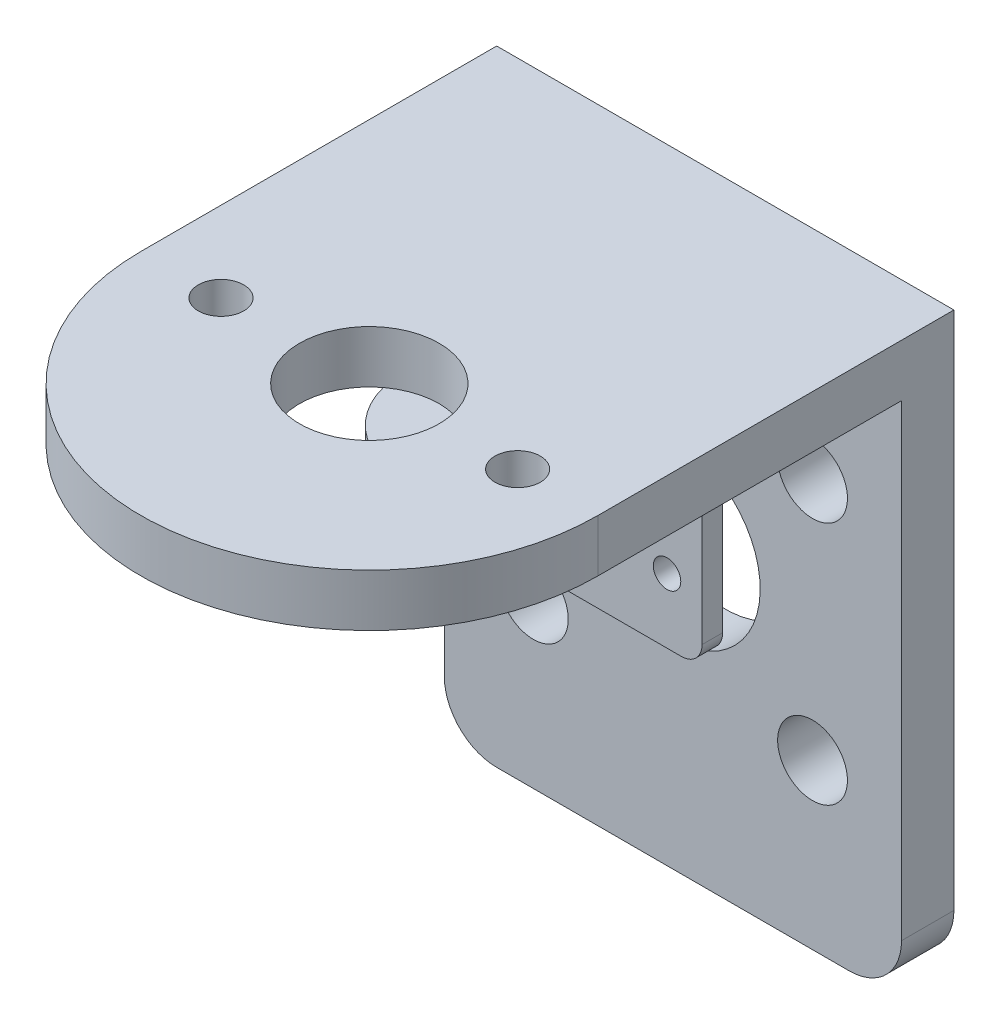
ISO-10303-21;
HEADER;
FILE_DESCRIPTION(('STEP AP214'),'2;1');
FILE_NAME('part.step','',(''),(''),'','','');
FILE_SCHEMA(('AUTOMOTIVE_DESIGN { 1 0 10303 214 1 1 1 1 }'));
ENDSEC;
DATA;
#1=APPLICATION_CONTEXT('core data for automotive mechanical design processes');
#2=APPLICATION_PROTOCOL_DEFINITION('international standard','automotive_design',2000,#1);
#3=PRODUCT_CONTEXT('',#1,'mechanical');
#4=PRODUCT('Part','Part','',(#3));
#5=PRODUCT_RELATED_PRODUCT_CATEGORY('part','',(#4));
#6=PRODUCT_DEFINITION_FORMATION('','',#4);
#7=PRODUCT_DEFINITION_CONTEXT('part definition',#1,'design');
#8=PRODUCT_DEFINITION('design','',#6,#7);
#9=PRODUCT_DEFINITION_SHAPE('','',#8);
#10=(LENGTH_UNIT() NAMED_UNIT(*) SI_UNIT(.MILLI.,.METRE.));
#11=(NAMED_UNIT(*) PLANE_ANGLE_UNIT() SI_UNIT($,.RADIAN.));
#12=(NAMED_UNIT(*) SI_UNIT($,.STERADIAN.) SOLID_ANGLE_UNIT());
#13=UNCERTAINTY_MEASURE_WITH_UNIT(LENGTH_MEASURE(1.E-05),#10,'distance_accuracy_value','');
#14=(GEOMETRIC_REPRESENTATION_CONTEXT(3) GLOBAL_UNCERTAINTY_ASSIGNED_CONTEXT((#13)) GLOBAL_UNIT_ASSIGNED_CONTEXT((#10,
#11,#12)) REPRESENTATION_CONTEXT('',''));
#15=CARTESIAN_POINT('',(0.,0.,0.));
#16=DIRECTION('',(0.,0.,1.));
#17=DIRECTION('',(1.,0.,0.));
#18=AXIS2_PLACEMENT_3D('',#15,#16,#17);
#19=CARTESIAN_POINT('',(33.274,172.119302794115,12.6989962074674));
#20=DIRECTION('',(0.,-1.,0.));
#21=DIRECTION('',(-1.,0.,0.));
#22=AXIS2_PLACEMENT_3D('',#19,#20,#21);
#23=PLANE('',#22);
#24=CARTESIAN_POINT('',(33.274,172.119302794115,12.6989962074674));
#25=DIRECTION('',(0.,-1.,0.));
#26=DIRECTION('',(1.,0.,0.));
#27=AXIS2_PLACEMENT_3D('',#24,#25,#26);
#28=CIRCLE('',#27,13.1);
#29=CARTESIAN_POINT('',(46.374,172.119302794115,12.6989962074674));
#30=VERTEX_POINT('',#29);
#31=CARTESIAN_POINT('',(20.174,172.119302794115,12.6989962074674));
#32=VERTEX_POINT('',#31);
#33=EDGE_CURVE('P0_E11',#30,#32,#28,.T.);
#34=ORIENTED_EDGE('',*,*,#33,.T.);
#35=DIRECTION('',(0.,0.,-1.));
#36=VECTOR('',#35,1.);
#37=CARTESIAN_POINT('',(20.174,172.119302794115,3.99899620746737));
#38=LINE('',#37,#36);
#39=CARTESIAN_POINT('',(20.174,172.119302794115,-4.70100379253262));
#40=VERTEX_POINT('',#39);
#41=EDGE_CURVE('P0_E220',#32,#40,#38,.T.);
#42=ORIENTED_EDGE('',*,*,#41,.T.);
#43=DIRECTION('',(1.,0.,0.));
#44=VECTOR('',#43,1.);
#45=CARTESIAN_POINT('',(33.274,172.119302794115,-4.70100379253262));
#46=LINE('',#45,#44);
#47=CARTESIAN_POINT('',(46.374,172.119302794115,-4.70100379253262));
#48=VERTEX_POINT('',#47);
#49=EDGE_CURVE('P0_E232',#40,#48,#46,.T.);
#50=ORIENTED_EDGE('',*,*,#49,.T.);
#51=DIRECTION('',(0.,0.,-1.));
#52=VECTOR('',#51,1.);
#53=CARTESIAN_POINT('',(46.374,172.119302794115,3.99899620746737));
#54=LINE('',#53,#52);
#55=EDGE_CURVE('P0_E225',#30,#48,#54,.T.);
#56=ORIENTED_EDGE('',*,*,#55,.F.);
#57=EDGE_LOOP('',(#34,#42,#50,#56));
#58=FACE_BOUND('',#57,.T.);
#59=CARTESIAN_POINT('',(24.774,172.119302794115,12.6989962074674));
#60=DIRECTION('',(0.,1.,0.));
#61=DIRECTION('',(0.,0.,1.));
#62=AXIS2_PLACEMENT_3D('',#59,#60,#61);
#63=CIRCLE('',#62,1.3);
#64=CARTESIAN_POINT('',(24.774,172.119302794115,13.9989962074674));
#65=VERTEX_POINT('',#64);
#66=EDGE_CURVE('P0_E218',#65,#65,#63,.T.);
#67=ORIENTED_EDGE('',*,*,#66,.T.);
#68=EDGE_LOOP('',(#67));
#69=FACE_BOUND('',#68,.T.);
#70=CARTESIAN_POINT('',(33.274,172.119302794115,12.6989962074674));
#71=DIRECTION('',(0.,1.,0.));
#72=DIRECTION('',(0.,0.,-1.));
#73=AXIS2_PLACEMENT_3D('',#70,#71,#72);
#74=CIRCLE('',#73,4.);
#75=CARTESIAN_POINT('',(33.274,172.119302794115,8.69899620746737));
#76=VERTEX_POINT('',#75);
#77=EDGE_CURVE('P0_E195',#76,#76,#74,.T.);
#78=ORIENTED_EDGE('',*,*,#77,.T.);
#79=EDGE_LOOP('',(#78));
#80=FACE_BOUND('',#79,.T.);
#81=CARTESIAN_POINT('',(41.774,172.119302794115,12.6989962074674));
#82=DIRECTION('',(0.,1.,0.));
#83=DIRECTION('',(0.,0.,-1.));
#84=AXIS2_PLACEMENT_3D('',#81,#82,#83);
#85=CIRCLE('',#84,1.3);
#86=CARTESIAN_POINT('',(41.774,172.119302794115,11.3989962074674));
#87=VERTEX_POINT('',#86);
#88=EDGE_CURVE('P0_E213',#87,#87,#85,.T.);
#89=ORIENTED_EDGE('',*,*,#88,.T.);
#90=EDGE_LOOP('',(#89));
#91=FACE_BOUND('',#90,.T.);
#92=ADVANCED_FACE('P0_F45',(#58,#69,#80,#91),#23,.T.);
#93=CARTESIAN_POINT('',(33.274,173.619302794115,12.6989962074674));
#94=DIRECTION('',(0.,-1.,0.));
#95=DIRECTION('',(1.,0.,0.));
#96=AXIS2_PLACEMENT_3D('',#93,#94,#95);
#97=CYLINDRICAL_SURFACE('',#96,13.1);
#98=DIRECTION('',(0.,1.,0.));
#99=VECTOR('',#98,1.);
#100=CARTESIAN_POINT('',(46.374,173.619302794115,12.6989962074674));
#101=LINE('',#100,#99);
#102=CARTESIAN_POINT('',(46.374,175.119302794115,12.6989962074674));
#103=VERTEX_POINT('',#102);
#104=EDGE_CURVE('P0_E227',#30,#103,#101,.T.);
#105=ORIENTED_EDGE('',*,*,#104,.T.);
#106=CARTESIAN_POINT('',(33.274,175.119302794115,12.6989962074674));
#107=DIRECTION('',(0.,1.,0.));
#108=DIRECTION('',(1.,0.,0.));
#109=AXIS2_PLACEMENT_3D('',#106,#107,#108);
#110=CIRCLE('',#109,13.1);
#111=CARTESIAN_POINT('',(20.174,175.119302794115,12.6989962074674));
#112=VERTEX_POINT('',#111);
#113=EDGE_CURVE('P0_E54',#112,#103,#110,.T.);
#114=ORIENTED_EDGE('',*,*,#113,.F.);
#115=DIRECTION('',(0.,-1.,0.));
#116=VECTOR('',#115,1.);
#117=CARTESIAN_POINT('',(20.174,173.619302794115,12.6989962074674));
#118=LINE('',#117,#116);
#119=EDGE_CURVE('P0_E224',#112,#32,#118,.T.);
#120=ORIENTED_EDGE('',*,*,#119,.T.);
#121=ORIENTED_EDGE('',*,*,#33,.F.);
#122=EDGE_LOOP('',(#105,#114,#120,#121));
#123=FACE_BOUND('',#122,.T.);
#124=ADVANCED_FACE('P0_F270',(#123),#97,.T.);
#125=CARTESIAN_POINT('',(33.274,175.119302794115,12.6989962074674));
#126=DIRECTION('',(0.,1.,0.));
#127=DIRECTION('',(1.,0.,0.));
#128=AXIS2_PLACEMENT_3D('',#125,#126,#127);
#129=PLANE('',#128);
#130=ORIENTED_EDGE('',*,*,#113,.T.);
#131=DIRECTION('',(0.,0.,-1.));
#132=VECTOR('',#131,1.);
#133=CARTESIAN_POINT('',(46.374,175.119302794115,3.99899620746737));
#134=LINE('',#133,#132);
#135=CARTESIAN_POINT('',(46.374,175.119302794115,-7.70100379253263));
#136=VERTEX_POINT('',#135);
#137=EDGE_CURVE('P0_E223',#103,#136,#134,.T.);
#138=ORIENTED_EDGE('',*,*,#137,.T.);
#139=DIRECTION('',(1.,0.,0.));
#140=VECTOR('',#139,1.);
#141=CARTESIAN_POINT('',(33.274,175.119302794115,-7.70100379253263));
#142=LINE('',#141,#140);
#143=CARTESIAN_POINT('',(20.174,175.119302794115,-7.70100379253263));
#144=VERTEX_POINT('',#143);
#145=EDGE_CURVE('P0_E199',#144,#136,#142,.T.);
#146=ORIENTED_EDGE('',*,*,#145,.F.);
#147=DIRECTION('',(0.,0.,-1.));
#148=VECTOR('',#147,1.);
#149=CARTESIAN_POINT('',(20.174,175.119302794115,-6.20100379253263));
#150=LINE('',#149,#148);
#151=EDGE_CURVE('P0_E221',#112,#144,#150,.T.);
#152=ORIENTED_EDGE('',*,*,#151,.F.);
#153=EDGE_LOOP('',(#130,#138,#146,#152));
#154=FACE_BOUND('',#153,.T.);
#155=CARTESIAN_POINT('',(24.774,175.119302794115,12.6989962074674));
#156=DIRECTION('',(0.,-1.,0.));
#157=DIRECTION('',(0.,0.,1.));
#158=AXIS2_PLACEMENT_3D('',#155,#156,#157);
#159=CIRCLE('',#158,1.3);
#160=CARTESIAN_POINT('',(24.774,175.119302794115,13.9989962074674));
#161=VERTEX_POINT('',#160);
#162=EDGE_CURVE('P0_E196',#161,#161,#159,.T.);
#163=ORIENTED_EDGE('',*,*,#162,.T.);
#164=EDGE_LOOP('',(#163));
#165=FACE_BOUND('',#164,.T.);
#166=CARTESIAN_POINT('',(33.274,175.119302794115,12.6989962074674));
#167=DIRECTION('',(0.,-1.,0.));
#168=DIRECTION('',(0.,0.,-1.));
#169=AXIS2_PLACEMENT_3D('',#166,#167,#168);
#170=CIRCLE('',#169,4.);
#171=CARTESIAN_POINT('',(33.274,175.119302794115,8.69899620746737));
#172=VERTEX_POINT('',#171);
#173=EDGE_CURVE('P0_E197',#172,#172,#170,.T.);
#174=ORIENTED_EDGE('',*,*,#173,.T.);
#175=EDGE_LOOP('',(#174));
#176=FACE_BOUND('',#175,.T.);
#177=CARTESIAN_POINT('',(41.774,175.119302794115,12.6989962074674));
#178=DIRECTION('',(0.,-1.,0.));
#179=DIRECTION('',(0.,0.,-1.));
#180=AXIS2_PLACEMENT_3D('',#177,#178,#179);
#181=CIRCLE('',#180,1.3);
#182=CARTESIAN_POINT('',(41.774,175.119302794115,11.3989962074674));
#183=VERTEX_POINT('',#182);
#184=EDGE_CURVE('P0_E211',#183,#183,#181,.T.);
#185=ORIENTED_EDGE('',*,*,#184,.T.);
#186=EDGE_LOOP('',(#185));
#187=FACE_BOUND('',#186,.T.);
#188=ADVANCED_FACE('P0_F273',(#154,#165,#176,#187),#129,.T.);
#189=CARTESIAN_POINT('',(46.374,173.619302794115,3.99899620746737));
#190=DIRECTION('',(1.,0.,0.));
#191=DIRECTION('',(0.,0.,1.));
#192=AXIS2_PLACEMENT_3D('',#189,#190,#191);
#193=PLANE('',#192);
#194=ORIENTED_EDGE('',*,*,#137,.F.);
#195=ORIENTED_EDGE('',*,*,#104,.F.);
#196=ORIENTED_EDGE('',*,*,#55,.T.);
#197=DIRECTION('',(0.,1.,0.));
#198=VECTOR('',#197,1.);
#199=CARTESIAN_POINT('',(46.374,158.719302794115,-4.70100379253263));
#200=LINE('',#199,#198);
#201=CARTESIAN_POINT('',(46.374,145.319302794115,-4.70100379253262));
#202=VERTEX_POINT('',#201);
#203=EDGE_CURVE('P0_E214',#202,#48,#200,.T.);
#204=ORIENTED_EDGE('',*,*,#203,.F.);
#205=DIRECTION('',(0.,0.,1.));
#206=VECTOR('',#205,1.);
#207=CARTESIAN_POINT('',(46.374,145.319302794115,-6.20100379253263));
#208=LINE('',#207,#206);
#209=CARTESIAN_POINT('',(46.374,145.319302794115,-7.70100379253263));
#210=VERTEX_POINT('',#209);
#211=EDGE_CURVE('P0_E194',#210,#202,#208,.T.);
#212=ORIENTED_EDGE('',*,*,#211,.F.);
#213=DIRECTION('',(0.,-1.,0.));
#214=VECTOR('',#213,1.);
#215=CARTESIAN_POINT('',(46.374,158.719302794115,-7.70100379253263));
#216=LINE('',#215,#214);
#217=EDGE_CURVE('P0_E198',#136,#210,#216,.T.);
#218=ORIENTED_EDGE('',*,*,#217,.F.);
#219=EDGE_LOOP('',(#194,#195,#196,#204,#212,#218));
#220=FACE_BOUND('',#219,.T.);
#221=ADVANCED_FACE('P0_F267',(#220),#193,.T.);
#222=CARTESIAN_POINT('',(20.174,173.619302794115,3.99899620746737));
#223=DIRECTION('',(-1.,0.,0.));
#224=DIRECTION('',(0.,0.,-1.));
#225=AXIS2_PLACEMENT_3D('',#222,#223,#224);
#226=PLANE('',#225);
#227=ORIENTED_EDGE('',*,*,#41,.F.);
#228=ORIENTED_EDGE('',*,*,#119,.F.);
#229=ORIENTED_EDGE('',*,*,#151,.T.);
#230=DIRECTION('',(0.,1.,0.));
#231=VECTOR('',#230,1.);
#232=CARTESIAN_POINT('',(20.174,158.719302794115,-7.70100379253263));
#233=LINE('',#232,#231);
#234=CARTESIAN_POINT('',(20.174,145.319302794115,-7.70100379253263));
#235=VERTEX_POINT('',#234);
#236=EDGE_CURVE('P0_E173',#235,#144,#233,.T.);
#237=ORIENTED_EDGE('',*,*,#236,.F.);
#238=DIRECTION('',(0.,0.,-1.));
#239=VECTOR('',#238,1.);
#240=CARTESIAN_POINT('',(20.174,145.319302794115,-6.20100379253263));
#241=LINE('',#240,#239);
#242=CARTESIAN_POINT('',(20.174,145.319302794115,-4.70100379253262));
#243=VERTEX_POINT('',#242);
#244=EDGE_CURVE('P0_E169',#243,#235,#241,.T.);
#245=ORIENTED_EDGE('',*,*,#244,.F.);
#246=DIRECTION('',(0.,-1.,0.));
#247=VECTOR('',#246,1.);
#248=CARTESIAN_POINT('',(20.174,158.719302794115,-4.70100379253263));
#249=LINE('',#248,#247);
#250=EDGE_CURVE('P0_E217',#40,#243,#249,.T.);
#251=ORIENTED_EDGE('',*,*,#250,.F.);
#252=EDGE_LOOP('',(#227,#228,#229,#237,#245,#251));
#253=FACE_BOUND('',#252,.T.);
#254=ADVANCED_FACE('P0_F260',(#253),#226,.T.);
#255=CARTESIAN_POINT('',(24.774,172.119302794115,12.6989962074674));
#256=DIRECTION('',(0.,-1.,0.));
#257=DIRECTION('',(0.,0.,1.));
#258=AXIS2_PLACEMENT_3D('',#255,#256,#257);
#259=CYLINDRICAL_SURFACE('',#258,1.3);
#260=ORIENTED_EDGE('',*,*,#66,.F.);
#261=EDGE_LOOP('',(#260));
#262=FACE_BOUND('',#261,.T.);
#263=ORIENTED_EDGE('',*,*,#162,.F.);
#264=EDGE_LOOP('',(#263));
#265=FACE_BOUND('',#264,.T.);
#266=ADVANCED_FACE('P0_F292',(#262,#265),#259,.F.);
#267=CARTESIAN_POINT('',(33.274,172.119302794115,12.6989962074674));
#268=DIRECTION('',(0.,-1.,0.));
#269=DIRECTION('',(0.,0.,-1.));
#270=AXIS2_PLACEMENT_3D('',#267,#268,#269);
#271=CYLINDRICAL_SURFACE('',#270,4.);
#272=ORIENTED_EDGE('',*,*,#77,.F.);
#273=EDGE_LOOP('',(#272));
#274=FACE_BOUND('',#273,.T.);
#275=ORIENTED_EDGE('',*,*,#173,.F.);
#276=EDGE_LOOP('',(#275));
#277=FACE_BOUND('',#276,.T.);
#278=ADVANCED_FACE('P0_F285',(#274,#277),#271,.F.);
#279=CARTESIAN_POINT('',(41.774,172.119302794115,12.6989962074674));
#280=DIRECTION('',(0.,-1.,0.));
#281=DIRECTION('',(0.,0.,-1.));
#282=AXIS2_PLACEMENT_3D('',#279,#280,#281);
#283=CYLINDRICAL_SURFACE('',#282,1.3);
#284=ORIENTED_EDGE('',*,*,#88,.F.);
#285=EDGE_LOOP('',(#284));
#286=FACE_BOUND('',#285,.T.);
#287=ORIENTED_EDGE('',*,*,#184,.F.);
#288=EDGE_LOOP('',(#287));
#289=FACE_BOUND('',#288,.T.);
#290=ADVANCED_FACE('P0_F283',(#286,#289),#283,.F.);
#291=CARTESIAN_POINT('',(33.274,158.719302794115,-4.70100379253263));
#292=DIRECTION('',(0.,0.,1.));
#293=DIRECTION('',(1.,0.,0.));
#294=AXIS2_PLACEMENT_3D('',#291,#292,#293);
#295=PLANE('',#294);
#296=CARTESIAN_POINT('',(41.274,165.719302794115,-4.70100379253262));
#297=DIRECTION('',(0.,0.,-1.));
#298=DIRECTION('',(0.,1.,0.));
#299=AXIS2_PLACEMENT_3D('',#296,#297,#298);
#300=CIRCLE('',#299,2.);
#301=CARTESIAN_POINT('',(41.274,167.719302794115,-4.70100379253262));
#302=VERTEX_POINT('',#301);
#303=EDGE_CURVE('P0_E144',#302,#302,#300,.T.);
#304=ORIENTED_EDGE('',*,*,#303,.T.);
#305=EDGE_LOOP('',(#304));
#306=FACE_BOUND('',#305,.T.);
#307=CARTESIAN_POINT('',(33.274,158.719302794115,-4.70100379253263));
#308=DIRECTION('',(0.,0.,-1.));
#309=DIRECTION('',(0.,1.,0.));
#310=AXIS2_PLACEMENT_3D('',#307,#308,#309);
#311=CIRCLE('',#310,5.);
#312=CARTESIAN_POINT('',(33.274,163.719302794115,-4.70100379253262));
#313=VERTEX_POINT('',#312);
#314=EDGE_CURVE('P0_E191',#313,#313,#311,.T.);
#315=ORIENTED_EDGE('',*,*,#314,.T.);
#316=EDGE_LOOP('',(#315));
#317=FACE_BOUND('',#316,.T.);
#318=CARTESIAN_POINT('',(41.274,151.719302794115,-4.70100379253262));
#319=DIRECTION('',(0.,0.,-1.));
#320=DIRECTION('',(1.,0.,0.));
#321=AXIS2_PLACEMENT_3D('',#318,#319,#320);
#322=CIRCLE('',#321,2.);
#323=CARTESIAN_POINT('',(43.274,151.719302794115,-4.70100379253262));
#324=VERTEX_POINT('',#323);
#325=EDGE_CURVE('P0_E247',#324,#324,#322,.T.);
#326=ORIENTED_EDGE('',*,*,#325,.T.);
#327=EDGE_LOOP('',(#326));
#328=FACE_BOUND('',#327,.T.);
#329=CARTESIAN_POINT('',(25.274,151.719302794115,-4.70100379253262));
#330=DIRECTION('',(0.,0.,-1.));
#331=DIRECTION('',(0.,1.,0.));
#332=AXIS2_PLACEMENT_3D('',#329,#330,#331);
#333=CIRCLE('',#332,2.);
#334=CARTESIAN_POINT('',(25.274,153.719302794115,-4.70100379253262));
#335=VERTEX_POINT('',#334);
#336=EDGE_CURVE('P0_E186',#335,#335,#333,.T.);
#337=ORIENTED_EDGE('',*,*,#336,.T.);
#338=EDGE_LOOP('',(#337));
#339=FACE_BOUND('',#338,.T.);
#340=CARTESIAN_POINT('',(25.274,165.719302794115,-4.70100379253262));
#341=DIRECTION('',(0.,0.,-1.));
#342=DIRECTION('',(-1.,0.,0.));
#343=AXIS2_PLACEMENT_3D('',#340,#341,#342);
#344=CIRCLE('',#343,2.);
#345=CARTESIAN_POINT('',(23.274,165.719302794115,-4.70100379253262));
#346=VERTEX_POINT('',#345);
#347=EDGE_CURVE('P0_E209',#346,#346,#344,.T.);
#348=ORIENTED_EDGE('',*,*,#347,.T.);
#349=EDGE_LOOP('',(#348));
#350=FACE_BOUND('',#349,.T.);
#351=ORIENTED_EDGE('',*,*,#49,.F.);
#352=ORIENTED_EDGE('',*,*,#250,.T.);
#353=CARTESIAN_POINT('',(23.174,145.319302794115,-4.70100379253262));
#354=DIRECTION('',(0.,0.,-1.));
#355=DIRECTION('',(-0.707106781186548,-0.707106781186547,0.));
#356=AXIS2_PLACEMENT_3D('',#353,#354,#355);
#357=CIRCLE('',#356,3.);
#358=CARTESIAN_POINT('',(23.174,142.319302794115,-4.70100379253262));
#359=VERTEX_POINT('',#358);
#360=EDGE_CURVE('P0_E163',#359,#243,#357,.T.);
#361=ORIENTED_EDGE('',*,*,#360,.F.);
#362=DIRECTION('',(1.,0.,0.));
#363=VECTOR('',#362,1.);
#364=CARTESIAN_POINT('',(33.274,142.319302794115,-4.70100379253262));
#365=LINE('',#364,#363);
#366=CARTESIAN_POINT('',(43.374,142.319302794115,-4.70100379253262));
#367=VERTEX_POINT('',#366);
#368=EDGE_CURVE('P0_E160',#359,#367,#365,.T.);
#369=ORIENTED_EDGE('',*,*,#368,.T.);
#370=CARTESIAN_POINT('',(43.374,145.319302794115,-4.70100379253262));
#371=DIRECTION('',(0.,0.,-1.));
#372=DIRECTION('',(0.707106781186548,-0.707106781186547,0.));
#373=AXIS2_PLACEMENT_3D('',#370,#371,#372);
#374=CIRCLE('',#373,3.);
#375=EDGE_CURVE('P0_E182',#202,#367,#374,.T.);
#376=ORIENTED_EDGE('',*,*,#375,.F.);
#377=ORIENTED_EDGE('',*,*,#203,.T.);
#378=EDGE_LOOP('',(#351,#352,#361,#369,#376,#377));
#379=FACE_BOUND('',#378,.T.);
#380=ADVANCED_FACE('P0_F262',(#306,#317,#328,#339,#350,#379),#295,.T.);
#381=CARTESIAN_POINT('',(23.174,145.319302794115,-6.20100379253263));
#382=DIRECTION('',(0.,0.,1.));
#383=DIRECTION('',(-0.707106781186548,-0.707106781186547,0.));
#384=AXIS2_PLACEMENT_3D('',#381,#382,#383);
#385=CYLINDRICAL_SURFACE('',#384,3.);
#386=CARTESIAN_POINT('',(23.174,145.319302794115,-7.70100379253263));
#387=DIRECTION('',(0.,0.,1.));
#388=DIRECTION('',(-0.707106781186548,-0.707106781186547,0.));
#389=AXIS2_PLACEMENT_3D('',#386,#387,#388);
#390=CIRCLE('',#389,3.);
#391=CARTESIAN_POINT('',(23.174,142.319302794115,-7.70100379253263));
#392=VERTEX_POINT('',#391);
#393=EDGE_CURVE('P0_E166',#235,#392,#390,.T.);
#394=ORIENTED_EDGE('',*,*,#393,.T.);
#395=DIRECTION('',(0.,0.,1.));
#396=VECTOR('',#395,1.);
#397=CARTESIAN_POINT('',(23.174,142.319302794115,-6.20100379253263));
#398=LINE('',#397,#396);
#399=EDGE_CURVE('P0_E157',#392,#359,#398,.T.);
#400=ORIENTED_EDGE('',*,*,#399,.T.);
#401=ORIENTED_EDGE('',*,*,#360,.T.);
#402=ORIENTED_EDGE('',*,*,#244,.T.);
#403=EDGE_LOOP('',(#394,#400,#401,#402));
#404=FACE_BOUND('',#403,.T.);
#405=ADVANCED_FACE('P0_F167',(#404),#385,.T.);
#406=CARTESIAN_POINT('',(33.274,142.319302794115,-6.20100379253263));
#407=DIRECTION('',(0.,1.,0.));
#408=DIRECTION('',(0.,0.,1.));
#409=AXIS2_PLACEMENT_3D('',#406,#407,#408);
#410=PLANE('',#409);
#411=DIRECTION('',(0.,0.,-1.));
#412=VECTOR('',#411,1.);
#413=CARTESIAN_POINT('',(43.374,142.319302794115,-6.20100379253263));
#414=LINE('',#413,#412);
#415=CARTESIAN_POINT('',(43.374,142.319302794115,-7.70100379253263));
#416=VERTEX_POINT('',#415);
#417=EDGE_CURVE('P0_E180',#367,#416,#414,.T.);
#418=ORIENTED_EDGE('',*,*,#417,.F.);
#419=ORIENTED_EDGE('',*,*,#368,.F.);
#420=ORIENTED_EDGE('',*,*,#399,.F.);
#421=DIRECTION('',(-1.,0.,0.));
#422=VECTOR('',#421,1.);
#423=CARTESIAN_POINT('',(33.274,142.319302794115,-7.70100379253263));
#424=LINE('',#423,#422);
#425=EDGE_CURVE('P0_E151',#416,#392,#424,.T.);
#426=ORIENTED_EDGE('',*,*,#425,.F.);
#427=EDGE_LOOP('',(#418,#419,#420,#426));
#428=FACE_BOUND('',#427,.T.);
#429=ADVANCED_FACE('P0_F159',(#428),#410,.F.);
#430=CARTESIAN_POINT('',(33.274,158.719302794115,-7.70100379253263));
#431=DIRECTION('',(0.,0.,1.));
#432=DIRECTION('',(1.,0.,0.));
#433=AXIS2_PLACEMENT_3D('',#430,#431,#432);
#434=PLANE('',#433);
#435=CARTESIAN_POINT('',(43.374,145.319302794115,-7.70100379253263));
#436=DIRECTION('',(0.,0.,1.));
#437=DIRECTION('',(0.707106781186548,-0.707106781186547,0.));
#438=AXIS2_PLACEMENT_3D('',#435,#436,#437);
#439=CIRCLE('',#438,3.);
#440=EDGE_CURVE('P0_E179',#416,#210,#439,.T.);
#441=ORIENTED_EDGE('',*,*,#440,.F.);
#442=ORIENTED_EDGE('',*,*,#425,.T.);
#443=ORIENTED_EDGE('',*,*,#393,.F.);
#444=ORIENTED_EDGE('',*,*,#236,.T.);
#445=ORIENTED_EDGE('',*,*,#145,.T.);
#446=ORIENTED_EDGE('',*,*,#217,.T.);
#447=EDGE_LOOP('',(#441,#442,#443,#444,#445,#446));
#448=FACE_BOUND('',#447,.T.);
#449=CARTESIAN_POINT('',(41.274,165.719302794115,-7.70100379253263));
#450=DIRECTION('',(0.,0.,1.));
#451=DIRECTION('',(0.,1.,0.));
#452=AXIS2_PLACEMENT_3D('',#449,#450,#451);
#453=CIRCLE('',#452,2.);
#454=CARTESIAN_POINT('',(41.274,163.719302794115,-7.70100379253263));
#455=VERTEX_POINT('',#454);
#456=EDGE_CURVE('P0_E190',#455,#455,#453,.T.);
#457=ORIENTED_EDGE('',*,*,#456,.T.);
#458=EDGE_LOOP('',(#457));
#459=FACE_BOUND('',#458,.T.);
#460=CARTESIAN_POINT('',(33.274,158.719302794115,-7.70100379253263));
#461=DIRECTION('',(0.,0.,1.));
#462=DIRECTION('',(0.,1.,0.));
#463=AXIS2_PLACEMENT_3D('',#460,#461,#462);
#464=CIRCLE('',#463,5.);
#465=CARTESIAN_POINT('',(33.274,163.719302794115,-7.70100379253263));
#466=VERTEX_POINT('',#465);
#467=EDGE_CURVE('P0_E48',#466,#466,#464,.T.);
#468=ORIENTED_EDGE('',*,*,#467,.T.);
#469=EDGE_LOOP('',(#468));
#470=FACE_BOUND('',#469,.T.);
#471=CARTESIAN_POINT('',(41.274,151.719302794115,-7.70100379253263));
#472=DIRECTION('',(0.,0.,1.));
#473=DIRECTION('',(1.,0.,0.));
#474=AXIS2_PLACEMENT_3D('',#471,#472,#473);
#475=CIRCLE('',#474,2.);
#476=CARTESIAN_POINT('',(43.274,151.719302794115,-7.70100379253263));
#477=VERTEX_POINT('',#476);
#478=EDGE_CURVE('P0_E188',#477,#477,#475,.T.);
#479=ORIENTED_EDGE('',*,*,#478,.T.);
#480=EDGE_LOOP('',(#479));
#481=FACE_BOUND('',#480,.T.);
#482=CARTESIAN_POINT('',(25.274,151.719302794115,-7.70100379253263));
#483=DIRECTION('',(0.,0.,1.));
#484=DIRECTION('',(0.,1.,0.));
#485=AXIS2_PLACEMENT_3D('',#482,#483,#484);
#486=CIRCLE('',#485,2.);
#487=CARTESIAN_POINT('',(25.274,153.719302794115,-7.70100379253263));
#488=VERTEX_POINT('',#487);
#489=EDGE_CURVE('P0_E189',#488,#488,#486,.T.);
#490=ORIENTED_EDGE('',*,*,#489,.T.);
#491=EDGE_LOOP('',(#490));
#492=FACE_BOUND('',#491,.T.);
#493=CARTESIAN_POINT('',(25.274,165.719302794115,-7.70100379253263));
#494=DIRECTION('',(0.,0.,1.));
#495=DIRECTION('',(-1.,0.,0.));
#496=AXIS2_PLACEMENT_3D('',#493,#494,#495);
#497=CIRCLE('',#496,2.);
#498=CARTESIAN_POINT('',(23.274,165.719302794115,-7.70100379253263));
#499=VERTEX_POINT('',#498);
#500=EDGE_CURVE('P0_E239',#499,#499,#497,.T.);
#501=ORIENTED_EDGE('',*,*,#500,.T.);
#502=EDGE_LOOP('',(#501));
#503=FACE_BOUND('',#502,.T.);
#504=ADVANCED_FACE('P0_F176',(#448,#459,#470,#481,#492,#503),#434,.F.);
#505=CARTESIAN_POINT('',(43.374,145.319302794115,-6.20100379253263));
#506=DIRECTION('',(0.,0.,1.));
#507=DIRECTION('',(0.707106781186548,-0.707106781186547,0.));
#508=AXIS2_PLACEMENT_3D('',#505,#506,#507);
#509=CYLINDRICAL_SURFACE('',#508,3.);
#510=ORIENTED_EDGE('',*,*,#440,.T.);
#511=ORIENTED_EDGE('',*,*,#211,.T.);
#512=ORIENTED_EDGE('',*,*,#375,.T.);
#513=ORIENTED_EDGE('',*,*,#417,.T.);
#514=EDGE_LOOP('',(#510,#511,#512,#513));
#515=FACE_BOUND('',#514,.T.);
#516=ADVANCED_FACE('P0_F315',(#515),#509,.T.);
#517=CARTESIAN_POINT('',(41.274,165.719302794115,-4.70100379253262));
#518=DIRECTION('',(0.,0.,1.));
#519=DIRECTION('',(0.,1.,0.));
#520=AXIS2_PLACEMENT_3D('',#517,#518,#519);
#521=CYLINDRICAL_SURFACE('',#520,2.);
#522=ORIENTED_EDGE('',*,*,#303,.F.);
#523=EDGE_LOOP('',(#522));
#524=FACE_BOUND('',#523,.T.);
#525=ORIENTED_EDGE('',*,*,#456,.F.);
#526=EDGE_LOOP('',(#525));
#527=FACE_BOUND('',#526,.T.);
#528=ADVANCED_FACE('P0_F312',(#524,#527),#521,.F.);
#529=CARTESIAN_POINT('',(33.274,158.719302794115,-4.70100379253263));
#530=DIRECTION('',(0.,0.,1.));
#531=DIRECTION('',(0.,1.,0.));
#532=AXIS2_PLACEMENT_3D('',#529,#530,#531);
#533=CYLINDRICAL_SURFACE('',#532,5.);
#534=ORIENTED_EDGE('',*,*,#314,.F.);
#535=EDGE_LOOP('',(#534));
#536=FACE_BOUND('',#535,.T.);
#537=ORIENTED_EDGE('',*,*,#467,.F.);
#538=EDGE_LOOP('',(#537));
#539=FACE_BOUND('',#538,.T.);
#540=ADVANCED_FACE('P0_F310',(#536,#539),#533,.F.);
#541=CARTESIAN_POINT('',(41.274,151.719302794115,-4.70100379253262));
#542=DIRECTION('',(0.,0.,1.));
#543=DIRECTION('',(1.,0.,0.));
#544=AXIS2_PLACEMENT_3D('',#541,#542,#543);
#545=CYLINDRICAL_SURFACE('',#544,2.);
#546=ORIENTED_EDGE('',*,*,#325,.F.);
#547=EDGE_LOOP('',(#546));
#548=FACE_BOUND('',#547,.T.);
#549=ORIENTED_EDGE('',*,*,#478,.F.);
#550=EDGE_LOOP('',(#549));
#551=FACE_BOUND('',#550,.T.);
#552=ADVANCED_FACE('P0_F307',(#548,#551),#545,.F.);
#553=CARTESIAN_POINT('',(25.274,151.719302794115,-4.70100379253262));
#554=DIRECTION('',(0.,0.,1.));
#555=DIRECTION('',(0.,1.,0.));
#556=AXIS2_PLACEMENT_3D('',#553,#554,#555);
#557=CYLINDRICAL_SURFACE('',#556,2.);
#558=ORIENTED_EDGE('',*,*,#336,.F.);
#559=EDGE_LOOP('',(#558));
#560=FACE_BOUND('',#559,.T.);
#561=ORIENTED_EDGE('',*,*,#489,.F.);
#562=EDGE_LOOP('',(#561));
#563=FACE_BOUND('',#562,.T.);
#564=ADVANCED_FACE('P0_F306',(#560,#563),#557,.F.);
#565=CARTESIAN_POINT('',(25.274,165.719302794115,-4.70100379253262));
#566=DIRECTION('',(0.,0.,1.));
#567=DIRECTION('',(-1.,0.,0.));
#568=AXIS2_PLACEMENT_3D('',#565,#566,#567);
#569=CYLINDRICAL_SURFACE('',#568,2.);
#570=ORIENTED_EDGE('',*,*,#347,.F.);
#571=EDGE_LOOP('',(#570));
#572=FACE_BOUND('',#571,.T.);
#573=ORIENTED_EDGE('',*,*,#500,.F.);
#574=EDGE_LOOP('',(#573));
#575=FACE_BOUND('',#574,.T.);
#576=ADVANCED_FACE('P0_F337',(#572,#575),#569,.F.);
#577=CLOSED_SHELL('',(#92,#124,#188,#221,#254,#266,#278,#290,#380,#405,#429,#504,#516,#528,#540,
#552,#564,#576));
#578=MANIFOLD_SOLID_BREP('P0_B2',#577);
#579=CARTESIAN_POINT('',(33.274,181.727414160453,30.6331524843708));
#580=DIRECTION('',(0.,-1.,0.));
#581=DIRECTION('',(-1.,0.,0.));
#582=AXIS2_PLACEMENT_3D('',#579,#580,#581);
#583=PLANE('',#582);
#584=CARTESIAN_POINT('',(33.274,181.727414160453,30.6331524843708));
#585=DIRECTION('',(0.,-1.,0.));
#586=DIRECTION('',(1.,0.,0.));
#587=AXIS2_PLACEMENT_3D('',#584,#585,#586);
#588=CIRCLE('',#587,33.274);
#589=CARTESIAN_POINT('',(66.548,181.727414160453,30.6331524843708));
#590=VERTEX_POINT('',#589);
#591=CARTESIAN_POINT('',(0.,181.727414160453,30.6331524843708));
#592=VERTEX_POINT('',#591);
#593=EDGE_CURVE('P1_E11',#590,#592,#588,.T.);
#594=ORIENTED_EDGE('',*,*,#593,.T.);
#595=DIRECTION('',(0.,0.,-1.));
#596=VECTOR('',#595,1.);
#597=CARTESIAN_POINT('',(0.,181.727414160453,8.53515248437081));
#598=LINE('',#597,#596);
#599=CARTESIAN_POINT('',(0.,181.727414160453,-13.5628475156292));
#600=VERTEX_POINT('',#599);
#601=EDGE_CURVE('P1_E191',#592,#600,#598,.T.);
#602=ORIENTED_EDGE('',*,*,#601,.T.);
#603=DIRECTION('',(1.,0.,0.));
#604=VECTOR('',#603,1.);
#605=CARTESIAN_POINT('',(33.274,181.727414160453,-13.5628475156292));
#606=LINE('',#605,#604);
#607=CARTESIAN_POINT('',(66.548,181.727414160453,-13.5628475156292));
#608=VERTEX_POINT('',#607);
#609=EDGE_CURVE('P1_E203',#600,#608,#606,.T.);
#610=ORIENTED_EDGE('',*,*,#609,.T.);
#611=DIRECTION('',(0.,0.,-1.));
#612=VECTOR('',#611,1.);
#613=CARTESIAN_POINT('',(66.548,181.727414160453,8.53515248437081));
#614=LINE('',#613,#612);
#615=EDGE_CURVE('P1_E196',#590,#608,#614,.T.);
#616=ORIENTED_EDGE('',*,*,#615,.F.);
#617=EDGE_LOOP('',(#594,#602,#610,#616));
#618=FACE_BOUND('',#617,.T.);
#619=CARTESIAN_POINT('',(11.684,181.727414160453,30.6331524843708));
#620=DIRECTION('',(0.,1.,0.));
#621=DIRECTION('',(0.,0.,1.));
#622=AXIS2_PLACEMENT_3D('',#619,#620,#621);
#623=CIRCLE('',#622,3.302);
#624=CARTESIAN_POINT('',(11.684,181.727414160453,33.9351524843708));
#625=VERTEX_POINT('',#624);
#626=EDGE_CURVE('P1_E189',#625,#625,#623,.T.);
#627=ORIENTED_EDGE('',*,*,#626,.T.);
#628=EDGE_LOOP('',(#627));
#629=FACE_BOUND('',#628,.T.);
#630=CARTESIAN_POINT('',(33.274,181.727414160453,30.6331524843708));
#631=DIRECTION('',(0.,1.,0.));
#632=DIRECTION('',(0.,0.,-1.));
#633=AXIS2_PLACEMENT_3D('',#630,#631,#632);
#634=CIRCLE('',#633,10.16);
#635=CARTESIAN_POINT('',(33.274,181.727414160453,20.4731524843708));
#636=VERTEX_POINT('',#635);
#637=EDGE_CURVE('P1_E166',#636,#636,#634,.T.);
#638=ORIENTED_EDGE('',*,*,#637,.T.);
#639=EDGE_LOOP('',(#638));
#640=FACE_BOUND('',#639,.T.);
#641=CARTESIAN_POINT('',(54.864,181.727414160453,30.6331524843708));
#642=DIRECTION('',(0.,1.,0.));
#643=DIRECTION('',(0.,0.,-1.));
#644=AXIS2_PLACEMENT_3D('',#641,#642,#643);
#645=CIRCLE('',#644,3.302);
#646=CARTESIAN_POINT('',(54.864,181.727414160453,27.3311524843708));
#647=VERTEX_POINT('',#646);
#648=EDGE_CURVE('P1_E184',#647,#647,#645,.T.);
#649=ORIENTED_EDGE('',*,*,#648,.T.);
#650=EDGE_LOOP('',(#649));
#651=FACE_BOUND('',#650,.T.);
#652=ADVANCED_FACE('P1_F16',(#618,#629,#640,#651),#583,.T.);
#653=CARTESIAN_POINT('',(33.274,185.537414160453,30.6331524843708));
#654=DIRECTION('',(0.,-1.,0.));
#655=DIRECTION('',(1.,0.,0.));
#656=AXIS2_PLACEMENT_3D('',#653,#654,#655);
#657=CYLINDRICAL_SURFACE('',#656,33.274);
#658=DIRECTION('',(0.,1.,0.));
#659=VECTOR('',#658,1.);
#660=CARTESIAN_POINT('',(66.548,185.537414160453,30.6331524843708));
#661=LINE('',#660,#659);
#662=CARTESIAN_POINT('',(66.548,189.347414160453,30.6331524843708));
#663=VERTEX_POINT('',#662);
#664=EDGE_CURVE('P1_E198',#590,#663,#661,.T.);
#665=ORIENTED_EDGE('',*,*,#664,.T.);
#666=CARTESIAN_POINT('',(33.274,189.347414160453,30.6331524843708));
#667=DIRECTION('',(0.,1.,0.));
#668=DIRECTION('',(1.,0.,0.));
#669=AXIS2_PLACEMENT_3D('',#666,#667,#668);
#670=CIRCLE('',#669,33.274);
#671=CARTESIAN_POINT('',(0.,189.347414160453,30.6331524843708));
#672=VERTEX_POINT('',#671);
#673=EDGE_CURVE('P1_E25',#672,#663,#670,.T.);
#674=ORIENTED_EDGE('',*,*,#673,.F.);
#675=DIRECTION('',(0.,-1.,0.));
#676=VECTOR('',#675,1.);
#677=CARTESIAN_POINT('',(0.,185.537414160453,30.6331524843708));
#678=LINE('',#677,#676);
#679=EDGE_CURVE('P1_E195',#672,#592,#678,.T.);
#680=ORIENTED_EDGE('',*,*,#679,.T.);
#681=ORIENTED_EDGE('',*,*,#593,.F.);
#682=EDGE_LOOP('',(#665,#674,#680,#681));
#683=FACE_BOUND('',#682,.T.);
#684=ADVANCED_FACE('P1_F241',(#683),#657,.T.);
#685=CARTESIAN_POINT('',(33.274,189.347414160453,30.6331524843708));
#686=DIRECTION('',(0.,1.,0.));
#687=DIRECTION('',(1.,0.,0.));
#688=AXIS2_PLACEMENT_3D('',#685,#686,#687);
#689=PLANE('',#688);
#690=ORIENTED_EDGE('',*,*,#673,.T.);
#691=DIRECTION('',(0.,0.,-1.));
#692=VECTOR('',#691,1.);
#693=CARTESIAN_POINT('',(66.548,189.347414160453,8.53515248437081));
#694=LINE('',#693,#692);
#695=CARTESIAN_POINT('',(66.548,189.347414160453,-21.1828475156292));
#696=VERTEX_POINT('',#695);
#697=EDGE_CURVE('P1_E194',#663,#696,#694,.T.);
#698=ORIENTED_EDGE('',*,*,#697,.T.);
#699=DIRECTION('',(1.,0.,0.));
#700=VECTOR('',#699,1.);
#701=CARTESIAN_POINT('',(33.274,189.347414160453,-21.1828475156292));
#702=LINE('',#701,#700);
#703=CARTESIAN_POINT('',(0.,189.347414160453,-21.1828475156292));
#704=VERTEX_POINT('',#703);
#705=EDGE_CURVE('P1_E170',#704,#696,#702,.T.);
#706=ORIENTED_EDGE('',*,*,#705,.F.);
#707=DIRECTION('',(0.,0.,-1.));
#708=VECTOR('',#707,1.);
#709=CARTESIAN_POINT('',(0.,189.347414160453,-17.3728475156292));
#710=LINE('',#709,#708);
#711=EDGE_CURVE('P1_E192',#672,#704,#710,.T.);
#712=ORIENTED_EDGE('',*,*,#711,.F.);
#713=EDGE_LOOP('',(#690,#698,#706,#712));
#714=FACE_BOUND('',#713,.T.);
#715=CARTESIAN_POINT('',(11.684,189.347414160453,30.6331524843708));
#716=DIRECTION('',(0.,-1.,0.));
#717=DIRECTION('',(0.,0.,1.));
#718=AXIS2_PLACEMENT_3D('',#715,#716,#717);
#719=CIRCLE('',#718,3.302);
#720=CARTESIAN_POINT('',(11.684,189.347414160453,33.9351524843708));
#721=VERTEX_POINT('',#720);
#722=EDGE_CURVE('P1_E167',#721,#721,#719,.T.);
#723=ORIENTED_EDGE('',*,*,#722,.T.);
#724=EDGE_LOOP('',(#723));
#725=FACE_BOUND('',#724,.T.);
#726=CARTESIAN_POINT('',(33.274,189.347414160453,30.6331524843708));
#727=DIRECTION('',(0.,-1.,0.));
#728=DIRECTION('',(0.,0.,-1.));
#729=AXIS2_PLACEMENT_3D('',#726,#727,#728);
#730=CIRCLE('',#729,10.16);
#731=CARTESIAN_POINT('',(33.274,189.347414160453,20.4731524843708));
#732=VERTEX_POINT('',#731);
#733=EDGE_CURVE('P1_E168',#732,#732,#730,.T.);
#734=ORIENTED_EDGE('',*,*,#733,.T.);
#735=EDGE_LOOP('',(#734));
#736=FACE_BOUND('',#735,.T.);
#737=CARTESIAN_POINT('',(54.864,189.347414160453,30.6331524843708));
#738=DIRECTION('',(0.,-1.,0.));
#739=DIRECTION('',(0.,0.,-1.));
#740=AXIS2_PLACEMENT_3D('',#737,#738,#739);
#741=CIRCLE('',#740,3.302);
#742=CARTESIAN_POINT('',(54.864,189.347414160453,27.3311524843708));
#743=VERTEX_POINT('',#742);
#744=EDGE_CURVE('P1_E182',#743,#743,#741,.T.);
#745=ORIENTED_EDGE('',*,*,#744,.T.);
#746=EDGE_LOOP('',(#745));
#747=FACE_BOUND('',#746,.T.);
#748=ADVANCED_FACE('P1_F244',(#714,#725,#736,#747),#689,.T.);
#749=CARTESIAN_POINT('',(66.548,185.537414160453,8.53515248437081));
#750=DIRECTION('',(1.,0.,0.));
#751=DIRECTION('',(0.,0.,1.));
#752=AXIS2_PLACEMENT_3D('',#749,#750,#751);
#753=PLANE('',#752);
#754=ORIENTED_EDGE('',*,*,#697,.F.);
#755=ORIENTED_EDGE('',*,*,#664,.F.);
#756=ORIENTED_EDGE('',*,*,#615,.T.);
#757=DIRECTION('',(0.,1.,0.));
#758=VECTOR('',#757,1.);
#759=CARTESIAN_POINT('',(66.548,147.691414160453,-13.5628475156292));
#760=LINE('',#759,#758);
#761=CARTESIAN_POINT('',(66.548,113.655414160453,-13.5628475156292));
#762=VERTEX_POINT('',#761);
#763=EDGE_CURVE('P1_E185',#762,#608,#760,.T.);
#764=ORIENTED_EDGE('',*,*,#763,.F.);
#765=DIRECTION('',(0.,0.,1.));
#766=VECTOR('',#765,1.);
#767=CARTESIAN_POINT('',(66.548,113.655414160453,-17.3728475156292));
#768=LINE('',#767,#766);
#769=CARTESIAN_POINT('',(66.548,113.655414160453,-21.1828475156292));
#770=VERTEX_POINT('',#769);
#771=EDGE_CURVE('P1_E165',#770,#762,#768,.T.);
#772=ORIENTED_EDGE('',*,*,#771,.F.);
#773=DIRECTION('',(0.,-1.,0.));
#774=VECTOR('',#773,1.);
#775=CARTESIAN_POINT('',(66.548,147.691414160453,-21.1828475156292));
#776=LINE('',#775,#774);
#777=EDGE_CURVE('P1_E169',#696,#770,#776,.T.);
#778=ORIENTED_EDGE('',*,*,#777,.F.);
#779=EDGE_LOOP('',(#754,#755,#756,#764,#772,#778));
#780=FACE_BOUND('',#779,.T.);
#781=ADVANCED_FACE('P1_F238',(#780),#753,.T.);
#782=CARTESIAN_POINT('',(0.,185.537414160453,8.53515248437081));
#783=DIRECTION('',(-1.,0.,0.));
#784=DIRECTION('',(0.,0.,-1.));
#785=AXIS2_PLACEMENT_3D('',#782,#783,#784);
#786=PLANE('',#785);
#787=ORIENTED_EDGE('',*,*,#601,.F.);
#788=ORIENTED_EDGE('',*,*,#679,.F.);
#789=ORIENTED_EDGE('',*,*,#711,.T.);
#790=DIRECTION('',(0.,1.,0.));
#791=VECTOR('',#790,1.);
#792=CARTESIAN_POINT('',(0.,147.691414160453,-21.1828475156292));
#793=LINE('',#792,#791);
#794=CARTESIAN_POINT('',(0.,113.655414160453,-21.1828475156292));
#795=VERTEX_POINT('',#794);
#796=EDGE_CURVE('P1_E144',#795,#704,#793,.T.);
#797=ORIENTED_EDGE('',*,*,#796,.F.);
#798=DIRECTION('',(0.,0.,-1.));
#799=VECTOR('',#798,1.);
#800=CARTESIAN_POINT('',(0.,113.655414160453,-17.3728475156292));
#801=LINE('',#800,#799);
#802=CARTESIAN_POINT('',(0.,113.655414160453,-13.5628475156292));
#803=VERTEX_POINT('',#802);
#804=EDGE_CURVE('P1_E140',#803,#795,#801,.T.);
#805=ORIENTED_EDGE('',*,*,#804,.F.);
#806=DIRECTION('',(0.,-1.,0.));
#807=VECTOR('',#806,1.);
#808=CARTESIAN_POINT('',(0.,147.691414160453,-13.5628475156292));
#809=LINE('',#808,#807);
#810=EDGE_CURVE('P1_E188',#600,#803,#809,.T.);
#811=ORIENTED_EDGE('',*,*,#810,.F.);
#812=EDGE_LOOP('',(#787,#788,#789,#797,#805,#811));
#813=FACE_BOUND('',#812,.T.);
#814=ADVANCED_FACE('P1_F231',(#813),#786,.T.);
#815=CARTESIAN_POINT('',(11.684,181.727414160453,30.6331524843708));
#816=DIRECTION('',(0.,-1.,0.));
#817=DIRECTION('',(0.,0.,1.));
#818=AXIS2_PLACEMENT_3D('',#815,#816,#817);
#819=CYLINDRICAL_SURFACE('',#818,3.302);
#820=ORIENTED_EDGE('',*,*,#626,.F.);
#821=EDGE_LOOP('',(#820));
#822=FACE_BOUND('',#821,.T.);
#823=ORIENTED_EDGE('',*,*,#722,.F.);
#824=EDGE_LOOP('',(#823));
#825=FACE_BOUND('',#824,.T.);
#826=ADVANCED_FACE('P1_F264',(#822,#825),#819,.F.);
#827=CARTESIAN_POINT('',(33.274,181.727414160453,30.6331524843708));
#828=DIRECTION('',(0.,-1.,0.));
#829=DIRECTION('',(0.,0.,-1.));
#830=AXIS2_PLACEMENT_3D('',#827,#828,#829);
#831=CYLINDRICAL_SURFACE('',#830,10.16);
#832=ORIENTED_EDGE('',*,*,#637,.F.);
#833=EDGE_LOOP('',(#832));
#834=FACE_BOUND('',#833,.T.);
#835=ORIENTED_EDGE('',*,*,#733,.F.);
#836=EDGE_LOOP('',(#835));
#837=FACE_BOUND('',#836,.T.);
#838=ADVANCED_FACE('P1_F256',(#834,#837),#831,.F.);
#839=CARTESIAN_POINT('',(54.864,181.727414160453,30.6331524843708));
#840=DIRECTION('',(0.,-1.,0.));
#841=DIRECTION('',(0.,0.,-1.));
#842=AXIS2_PLACEMENT_3D('',#839,#840,#841);
#843=CYLINDRICAL_SURFACE('',#842,3.302);
#844=ORIENTED_EDGE('',*,*,#648,.F.);
#845=EDGE_LOOP('',(#844));
#846=FACE_BOUND('',#845,.T.);
#847=ORIENTED_EDGE('',*,*,#744,.F.);
#848=EDGE_LOOP('',(#847));
#849=FACE_BOUND('',#848,.T.);
#850=ADVANCED_FACE('P1_F254',(#846,#849),#843,.F.);
#851=CARTESIAN_POINT('',(33.274,147.691414160453,-13.5628475156292));
#852=DIRECTION('',(0.,0.,1.));
#853=DIRECTION('',(1.,0.,0.));
#854=AXIS2_PLACEMENT_3D('',#851,#852,#853);
#855=PLANE('',#854);
#856=CARTESIAN_POINT('',(53.594,165.471414160453,-13.5628475156292));
#857=DIRECTION('',(0.,0.,-1.));
#858=DIRECTION('',(0.,1.,0.));
#859=AXIS2_PLACEMENT_3D('',#856,#857,#858);
#860=CIRCLE('',#859,5.08);
#861=CARTESIAN_POINT('',(53.594,170.551414160453,-13.5628475156292));
#862=VERTEX_POINT('',#861);
#863=EDGE_CURVE('P1_E115',#862,#862,#860,.T.);
#864=ORIENTED_EDGE('',*,*,#863,.T.);
#865=EDGE_LOOP('',(#864));
#866=FACE_BOUND('',#865,.T.);
#867=CARTESIAN_POINT('',(33.274,147.691414160453,-13.5628475156292));
#868=DIRECTION('',(0.,0.,-1.));
#869=DIRECTION('',(0.,1.,0.));
#870=AXIS2_PLACEMENT_3D('',#867,#868,#869);
#871=CIRCLE('',#870,12.7);
#872=CARTESIAN_POINT('',(33.274,160.391414160453,-13.5628475156292));
#873=VERTEX_POINT('',#872);
#874=EDGE_CURVE('P1_E162',#873,#873,#871,.T.);
#875=ORIENTED_EDGE('',*,*,#874,.T.);
#876=EDGE_LOOP('',(#875));
#877=FACE_BOUND('',#876,.T.);
#878=CARTESIAN_POINT('',(53.594,129.911414160453,-13.5628475156292));
#879=DIRECTION('',(0.,0.,-1.));
#880=DIRECTION('',(1.,0.,0.));
#881=AXIS2_PLACEMENT_3D('',#878,#879,#880);
#882=CIRCLE('',#881,5.08);
#883=CARTESIAN_POINT('',(58.674,129.911414160453,-13.5628475156292));
#884=VERTEX_POINT('',#883);
#885=EDGE_CURVE('P1_E218',#884,#884,#882,.T.);
#886=ORIENTED_EDGE('',*,*,#885,.T.);
#887=EDGE_LOOP('',(#886));
#888=FACE_BOUND('',#887,.T.);
#889=CARTESIAN_POINT('',(12.954,129.911414160453,-13.5628475156292));
#890=DIRECTION('',(0.,0.,-1.));
#891=DIRECTION('',(0.,1.,0.));
#892=AXIS2_PLACEMENT_3D('',#889,#890,#891);
#893=CIRCLE('',#892,5.08);
#894=CARTESIAN_POINT('',(12.954,134.991414160453,-13.5628475156292));
#895=VERTEX_POINT('',#894);
#896=EDGE_CURVE('P1_E157',#895,#895,#893,.T.);
#897=ORIENTED_EDGE('',*,*,#896,.T.);
#898=EDGE_LOOP('',(#897));
#899=FACE_BOUND('',#898,.T.);
#900=CARTESIAN_POINT('',(12.954,165.471414160453,-13.5628475156292));
#901=DIRECTION('',(0.,0.,-1.));
#902=DIRECTION('',(-1.,0.,0.));
#903=AXIS2_PLACEMENT_3D('',#900,#901,#902);
#904=CIRCLE('',#903,5.08);
#905=CARTESIAN_POINT('',(7.874,165.471414160453,-13.5628475156292));
#906=VERTEX_POINT('',#905);
#907=EDGE_CURVE('P1_E180',#906,#906,#904,.T.);
#908=ORIENTED_EDGE('',*,*,#907,.T.);
#909=EDGE_LOOP('',(#908));
#910=FACE_BOUND('',#909,.T.);
#911=ORIENTED_EDGE('',*,*,#609,.F.);
#912=ORIENTED_EDGE('',*,*,#810,.T.);
#913=CARTESIAN_POINT('',(7.62,113.655414160453,-13.5628475156292));
#914=DIRECTION('',(0.,0.,-1.));
#915=DIRECTION('',(-0.707106781186548,-0.707106781186547,0.));
#916=AXIS2_PLACEMENT_3D('',#913,#914,#915);
#917=CIRCLE('',#916,7.62);
#918=CARTESIAN_POINT('',(7.62,106.035414160453,-13.5628475156292));
#919=VERTEX_POINT('',#918);
#920=EDGE_CURVE('P1_E134',#919,#803,#917,.T.);
#921=ORIENTED_EDGE('',*,*,#920,.F.);
#922=DIRECTION('',(1.,0.,0.));
#923=VECTOR('',#922,1.);
#924=CARTESIAN_POINT('',(33.274,106.035414160453,-13.5628475156292));
#925=LINE('',#924,#923);
#926=CARTESIAN_POINT('',(58.928,106.035414160453,-13.5628475156292));
#927=VERTEX_POINT('',#926);
#928=EDGE_CURVE('P1_E131',#919,#927,#925,.T.);
#929=ORIENTED_EDGE('',*,*,#928,.T.);
#930=CARTESIAN_POINT('',(58.928,113.655414160453,-13.5628475156292));
#931=DIRECTION('',(0.,0.,-1.));
#932=DIRECTION('',(0.707106781186548,-0.707106781186547,0.));
#933=AXIS2_PLACEMENT_3D('',#930,#931,#932);
#934=CIRCLE('',#933,7.62);
#935=EDGE_CURVE('P1_E153',#762,#927,#934,.T.);
#936=ORIENTED_EDGE('',*,*,#935,.F.);
#937=ORIENTED_EDGE('',*,*,#763,.T.);
#938=EDGE_LOOP('',(#911,#912,#921,#929,#936,#937));
#939=FACE_BOUND('',#938,.T.);
#940=ADVANCED_FACE('P1_F233',(#866,#877,#888,#899,#910,#939),#855,.T.);
#941=CARTESIAN_POINT('',(7.62,113.655414160453,-17.3728475156292));
#942=DIRECTION('',(0.,0.,1.));
#943=DIRECTION('',(-0.707106781186548,-0.707106781186547,0.));
#944=AXIS2_PLACEMENT_3D('',#941,#942,#943);
#945=CYLINDRICAL_SURFACE('',#944,7.62);
#946=CARTESIAN_POINT('',(7.62,113.655414160453,-21.1828475156292));
#947=DIRECTION('',(0.,0.,1.));
#948=DIRECTION('',(-0.707106781186548,-0.707106781186547,0.));
#949=AXIS2_PLACEMENT_3D('',#946,#947,#948);
#950=CIRCLE('',#949,7.62);
#951=CARTESIAN_POINT('',(7.62,106.035414160453,-21.1828475156292));
#952=VERTEX_POINT('',#951);
#953=EDGE_CURVE('P1_E137',#795,#952,#950,.T.);
#954=ORIENTED_EDGE('',*,*,#953,.T.);
#955=DIRECTION('',(0.,0.,1.));
#956=VECTOR('',#955,1.);
#957=CARTESIAN_POINT('',(7.62,106.035414160453,-17.3728475156292));
#958=LINE('',#957,#956);
#959=EDGE_CURVE('P1_E128',#952,#919,#958,.T.);
#960=ORIENTED_EDGE('',*,*,#959,.T.);
#961=ORIENTED_EDGE('',*,*,#920,.T.);
#962=ORIENTED_EDGE('',*,*,#804,.T.);
#963=EDGE_LOOP('',(#954,#960,#961,#962));
#964=FACE_BOUND('',#963,.T.);
#965=ADVANCED_FACE('P1_F138',(#964),#945,.T.);
#966=CARTESIAN_POINT('',(33.274,106.035414160453,-17.3728475156292));
#967=DIRECTION('',(0.,1.,0.));
#968=DIRECTION('',(0.,0.,1.));
#969=AXIS2_PLACEMENT_3D('',#966,#967,#968);
#970=PLANE('',#969);
#971=DIRECTION('',(0.,0.,-1.));
#972=VECTOR('',#971,1.);
#973=CARTESIAN_POINT('',(58.928,106.035414160453,-17.3728475156292));
#974=LINE('',#973,#972);
#975=CARTESIAN_POINT('',(58.928,106.035414160453,-21.1828475156292));
#976=VERTEX_POINT('',#975);
#977=EDGE_CURVE('P1_E151',#927,#976,#974,.T.);
#978=ORIENTED_EDGE('',*,*,#977,.F.);
#979=ORIENTED_EDGE('',*,*,#928,.F.);
#980=ORIENTED_EDGE('',*,*,#959,.F.);
#981=DIRECTION('',(-1.,0.,0.));
#982=VECTOR('',#981,1.);
#983=CARTESIAN_POINT('',(33.274,106.035414160453,-21.1828475156292));
#984=LINE('',#983,#982);
#985=EDGE_CURVE('P1_E122',#976,#952,#984,.T.);
#986=ORIENTED_EDGE('',*,*,#985,.F.);
#987=EDGE_LOOP('',(#978,#979,#980,#986));
#988=FACE_BOUND('',#987,.T.);
#989=ADVANCED_FACE('P1_F130',(#988),#970,.F.);
#990=CARTESIAN_POINT('',(33.274,147.691414160453,-21.1828475156292));
#991=DIRECTION('',(0.,0.,1.));
#992=DIRECTION('',(1.,0.,0.));
#993=AXIS2_PLACEMENT_3D('',#990,#991,#992);
#994=PLANE('',#993);
#995=CARTESIAN_POINT('',(58.928,113.655414160453,-21.1828475156292));
#996=DIRECTION('',(0.,0.,1.));
#997=DIRECTION('',(0.707106781186548,-0.707106781186547,0.));
#998=AXIS2_PLACEMENT_3D('',#995,#996,#997);
#999=CIRCLE('',#998,7.62);
#1000=EDGE_CURVE('P1_E150',#976,#770,#999,.T.);
#1001=ORIENTED_EDGE('',*,*,#1000,.F.);
#1002=ORIENTED_EDGE('',*,*,#985,.T.);
#1003=ORIENTED_EDGE('',*,*,#953,.F.);
#1004=ORIENTED_EDGE('',*,*,#796,.T.);
#1005=ORIENTED_EDGE('',*,*,#705,.T.);
#1006=ORIENTED_EDGE('',*,*,#777,.T.);
#1007=EDGE_LOOP('',(#1001,#1002,#1003,#1004,#1005,#1006));
#1008=FACE_BOUND('',#1007,.T.);
#1009=CARTESIAN_POINT('',(53.594,165.471414160453,-21.1828475156292));
#1010=DIRECTION('',(0.,0.,1.));
#1011=DIRECTION('',(0.,1.,0.));
#1012=AXIS2_PLACEMENT_3D('',#1009,#1010,#1011);
#1013=CIRCLE('',#1012,5.08);
#1014=CARTESIAN_POINT('',(53.594,160.391414160453,-21.1828475156292));
#1015=VERTEX_POINT('',#1014);
#1016=EDGE_CURVE('P1_E161',#1015,#1015,#1013,.T.);
#1017=ORIENTED_EDGE('',*,*,#1016,.T.);
#1018=EDGE_LOOP('',(#1017));
#1019=FACE_BOUND('',#1018,.T.);
#1020=CARTESIAN_POINT('',(33.274,147.691414160453,-21.1828475156292));
#1021=DIRECTION('',(0.,0.,1.));
#1022=DIRECTION('',(0.,1.,0.));
#1023=AXIS2_PLACEMENT_3D('',#1020,#1021,#1022);
#1024=CIRCLE('',#1023,12.7);
#1025=CARTESIAN_POINT('',(33.274,160.391414160453,-21.1828475156292));
#1026=VERTEX_POINT('',#1025);
#1027=EDGE_CURVE('P1_E19',#1026,#1026,#1024,.T.);
#1028=ORIENTED_EDGE('',*,*,#1027,.T.);
#1029=EDGE_LOOP('',(#1028));
#1030=FACE_BOUND('',#1029,.T.);
#1031=CARTESIAN_POINT('',(53.594,129.911414160453,-21.1828475156292));
#1032=DIRECTION('',(0.,0.,1.));
#1033=DIRECTION('',(1.,0.,0.));
#1034=AXIS2_PLACEMENT_3D('',#1031,#1032,#1033);
#1035=CIRCLE('',#1034,5.08);
#1036=CARTESIAN_POINT('',(58.674,129.911414160453,-21.1828475156292));
#1037=VERTEX_POINT('',#1036);
#1038=EDGE_CURVE('P1_E159',#1037,#1037,#1035,.T.);
#1039=ORIENTED_EDGE('',*,*,#1038,.T.);
#1040=EDGE_LOOP('',(#1039));
#1041=FACE_BOUND('',#1040,.T.);
#1042=CARTESIAN_POINT('',(12.954,129.911414160453,-21.1828475156292));
#1043=DIRECTION('',(0.,0.,1.));
#1044=DIRECTION('',(0.,1.,0.));
#1045=AXIS2_PLACEMENT_3D('',#1042,#1043,#1044);
#1046=CIRCLE('',#1045,5.08);
#1047=CARTESIAN_POINT('',(12.954,134.991414160453,-21.1828475156292));
#1048=VERTEX_POINT('',#1047);
#1049=EDGE_CURVE('P1_E160',#1048,#1048,#1046,.T.);
#1050=ORIENTED_EDGE('',*,*,#1049,.T.);
#1051=EDGE_LOOP('',(#1050));
#1052=FACE_BOUND('',#1051,.T.);
#1053=CARTESIAN_POINT('',(12.954,165.471414160453,-21.1828475156292));
#1054=DIRECTION('',(0.,0.,1.));
#1055=DIRECTION('',(-1.,0.,0.));
#1056=AXIS2_PLACEMENT_3D('',#1053,#1054,#1055);
#1057=CIRCLE('',#1056,5.08);
#1058=CARTESIAN_POINT('',(7.874,165.471414160453,-21.1828475156292));
#1059=VERTEX_POINT('',#1058);
#1060=EDGE_CURVE('P1_E210',#1059,#1059,#1057,.T.);
#1061=ORIENTED_EDGE('',*,*,#1060,.T.);
#1062=EDGE_LOOP('',(#1061));
#1063=FACE_BOUND('',#1062,.T.);
#1064=ADVANCED_FACE('P1_F147',(#1008,#1019,#1030,#1041,#1052,#1063),#994,.F.);
#1065=CARTESIAN_POINT('',(58.928,113.655414160453,-17.3728475156292));
#1066=DIRECTION('',(0.,0.,1.));
#1067=DIRECTION('',(0.707106781186548,-0.707106781186547,0.));
#1068=AXIS2_PLACEMENT_3D('',#1065,#1066,#1067);
#1069=CYLINDRICAL_SURFACE('',#1068,7.62);
#1070=ORIENTED_EDGE('',*,*,#1000,.T.);
#1071=ORIENTED_EDGE('',*,*,#771,.T.);
#1072=ORIENTED_EDGE('',*,*,#935,.T.);
#1073=ORIENTED_EDGE('',*,*,#977,.T.);
#1074=EDGE_LOOP('',(#1070,#1071,#1072,#1073));
#1075=FACE_BOUND('',#1074,.T.);
#1076=ADVANCED_FACE('P1_F287',(#1075),#1069,.T.);
#1077=CARTESIAN_POINT('',(53.594,165.471414160453,-13.5628475156292));
#1078=DIRECTION('',(0.,0.,1.));
#1079=DIRECTION('',(0.,1.,0.));
#1080=AXIS2_PLACEMENT_3D('',#1077,#1078,#1079);
#1081=CYLINDRICAL_SURFACE('',#1080,5.08);
#1082=ORIENTED_EDGE('',*,*,#863,.F.);
#1083=EDGE_LOOP('',(#1082));
#1084=FACE_BOUND('',#1083,.T.);
#1085=ORIENTED_EDGE('',*,*,#1016,.F.);
#1086=EDGE_LOOP('',(#1085));
#1087=FACE_BOUND('',#1086,.T.);
#1088=ADVANCED_FACE('P1_F284',(#1084,#1087),#1081,.F.);
#1089=CARTESIAN_POINT('',(33.274,147.691414160453,-13.5628475156292));
#1090=DIRECTION('',(0.,0.,1.));
#1091=DIRECTION('',(0.,1.,0.));
#1092=AXIS2_PLACEMENT_3D('',#1089,#1090,#1091);
#1093=CYLINDRICAL_SURFACE('',#1092,12.7);
#1094=ORIENTED_EDGE('',*,*,#874,.F.);
#1095=EDGE_LOOP('',(#1094));
#1096=FACE_BOUND('',#1095,.T.);
#1097=ORIENTED_EDGE('',*,*,#1027,.F.);
#1098=EDGE_LOOP('',(#1097));
#1099=FACE_BOUND('',#1098,.T.);
#1100=ADVANCED_FACE('P1_F282',(#1096,#1099),#1093,.F.);
#1101=CARTESIAN_POINT('',(53.594,129.911414160453,-13.5628475156292));
#1102=DIRECTION('',(0.,0.,1.));
#1103=DIRECTION('',(1.,0.,0.));
#1104=AXIS2_PLACEMENT_3D('',#1101,#1102,#1103);
#1105=CYLINDRICAL_SURFACE('',#1104,5.08);
#1106=ORIENTED_EDGE('',*,*,#885,.F.);
#1107=EDGE_LOOP('',(#1106));
#1108=FACE_BOUND('',#1107,.T.);
#1109=ORIENTED_EDGE('',*,*,#1038,.F.);
#1110=EDGE_LOOP('',(#1109));
#1111=FACE_BOUND('',#1110,.T.);
#1112=ADVANCED_FACE('P1_F279',(#1108,#1111),#1105,.F.);
#1113=CARTESIAN_POINT('',(12.954,129.911414160453,-13.5628475156292));
#1114=DIRECTION('',(0.,0.,1.));
#1115=DIRECTION('',(0.,1.,0.));
#1116=AXIS2_PLACEMENT_3D('',#1113,#1114,#1115);
#1117=CYLINDRICAL_SURFACE('',#1116,5.08);
#1118=ORIENTED_EDGE('',*,*,#896,.F.);
#1119=EDGE_LOOP('',(#1118));
#1120=FACE_BOUND('',#1119,.T.);
#1121=ORIENTED_EDGE('',*,*,#1049,.F.);
#1122=EDGE_LOOP('',(#1121));
#1123=FACE_BOUND('',#1122,.T.);
#1124=ADVANCED_FACE('P1_F278',(#1120,#1123),#1117,.F.);
#1125=CARTESIAN_POINT('',(12.954,165.471414160453,-13.5628475156292));
#1126=DIRECTION('',(0.,0.,1.));
#1127=DIRECTION('',(-1.,0.,0.));
#1128=AXIS2_PLACEMENT_3D('',#1125,#1126,#1127);
#1129=CYLINDRICAL_SURFACE('',#1128,5.08);
#1130=ORIENTED_EDGE('',*,*,#907,.F.);
#1131=EDGE_LOOP('',(#1130));
#1132=FACE_BOUND('',#1131,.T.);
#1133=ORIENTED_EDGE('',*,*,#1060,.F.);
#1134=EDGE_LOOP('',(#1133));
#1135=FACE_BOUND('',#1134,.T.);
#1136=ADVANCED_FACE('P1_F309',(#1132,#1135),#1129,.F.);
#1137=CLOSED_SHELL('',(#652,#684,#748,#781,#814,#826,#838,#850,#940,#965,#989,#1064,#1076,#1088,
#1100,#1112,#1124,#1136));
#1138=MANIFOLD_SOLID_BREP('P1_B1',#1137);
#1139=ADVANCED_BREP_SHAPE_REPRESENTATION('',(#18,#578,#1138),#14);
#1140=SHAPE_DEFINITION_REPRESENTATION(#9,#1139);
ENDSEC;
END-ISO-10303-21;
